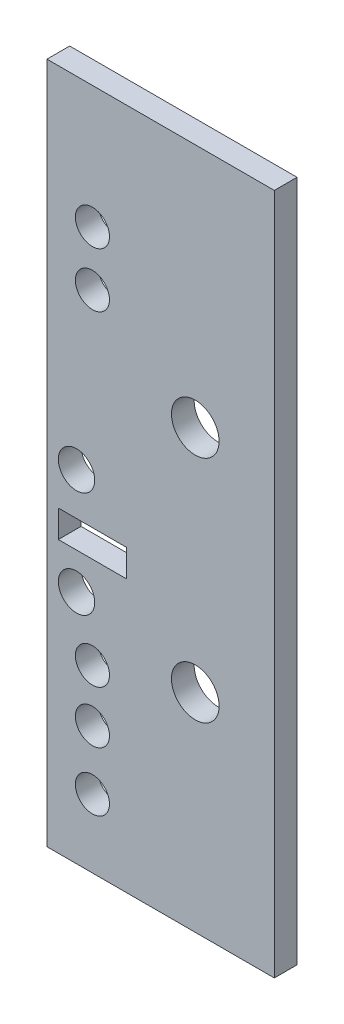
ISO-10303-21;
HEADER;
FILE_DESCRIPTION(('STEP AP214'),'2;1');
FILE_NAME('part.step','',(''),(''),'','','');
FILE_SCHEMA(('AUTOMOTIVE_DESIGN { 1 0 10303 214 1 1 1 1 }'));
ENDSEC;
DATA;
#1=APPLICATION_CONTEXT('core data for automotive mechanical design processes');
#2=APPLICATION_PROTOCOL_DEFINITION('international standard','automotive_design',2000,#1);
#3=PRODUCT_CONTEXT('',#1,'mechanical');
#4=PRODUCT('Part','Part','',(#3));
#5=PRODUCT_RELATED_PRODUCT_CATEGORY('part','',(#4));
#6=PRODUCT_DEFINITION_FORMATION('','',#4);
#7=PRODUCT_DEFINITION_CONTEXT('part definition',#1,'design');
#8=PRODUCT_DEFINITION('design','',#6,#7);
#9=PRODUCT_DEFINITION_SHAPE('','',#8);
#10=(LENGTH_UNIT() NAMED_UNIT(*) SI_UNIT(.MILLI.,.METRE.));
#11=(NAMED_UNIT(*) PLANE_ANGLE_UNIT() SI_UNIT($,.RADIAN.));
#12=(NAMED_UNIT(*) SI_UNIT($,.STERADIAN.) SOLID_ANGLE_UNIT());
#13=UNCERTAINTY_MEASURE_WITH_UNIT(LENGTH_MEASURE(1.E-05),#10,'distance_accuracy_value','');
#14=(GEOMETRIC_REPRESENTATION_CONTEXT(3) GLOBAL_UNCERTAINTY_ASSIGNED_CONTEXT((#13)) GLOBAL_UNIT_ASSIGNED_CONTEXT((#10,
#11,#12)) REPRESENTATION_CONTEXT('',''));
#15=CARTESIAN_POINT('',(0.,0.,0.));
#16=DIRECTION('',(0.,0.,1.));
#17=DIRECTION('',(1.,0.,0.));
#18=AXIS2_PLACEMENT_3D('',#15,#16,#17);
#19=CARTESIAN_POINT('',(-23.321554770318,41.8114649543858,5.));
#20=DIRECTION('',(1.,0.,0.));
#21=DIRECTION('',(0.,1.,0.));
#22=AXIS2_PLACEMENT_3D('',#19,#20,#21);
#23=PLANE('',#22);
#24=DIRECTION('',(0.,-1.,0.));
#25=VECTOR('',#24,1.);
#26=CARTESIAN_POINT('',(-23.321554770318,41.8114649543858,0.));
#27=LINE('',#26,#25);
#28=CARTESIAN_POINT('',(-23.321554770318,41.8114649543858,0.));
#29=VERTEX_POINT('',#28);
#30=CARTESIAN_POINT('',(-23.321554770318,-108.188535045614,0.));
#31=VERTEX_POINT('',#30);
#32=EDGE_CURVE('E183',#29,#31,#27,.T.);
#33=ORIENTED_EDGE('',*,*,#32,.T.);
#34=DIRECTION('',(0.,0.,-1.));
#35=VECTOR('',#34,1.);
#36=CARTESIAN_POINT('',(-23.321554770318,-108.188535045614,5.));
#37=LINE('',#36,#35);
#38=CARTESIAN_POINT('',(-23.321554770318,-108.188535045614,5.));
#39=VERTEX_POINT('',#38);
#40=EDGE_CURVE('E11',#39,#31,#37,.T.);
#41=ORIENTED_EDGE('',*,*,#40,.F.);
#42=DIRECTION('',(0.,-1.,0.));
#43=VECTOR('',#42,1.);
#44=CARTESIAN_POINT('',(-23.321554770318,41.8114649543858,5.));
#45=LINE('',#44,#43);
#46=CARTESIAN_POINT('',(-23.321554770318,41.8114649543858,5.));
#47=VERTEX_POINT('',#46);
#48=EDGE_CURVE('E219',#47,#39,#45,.T.);
#49=ORIENTED_EDGE('',*,*,#48,.F.);
#50=DIRECTION('',(0.,0.,-1.));
#51=VECTOR('',#50,1.);
#52=CARTESIAN_POINT('',(-23.321554770318,41.8114649543858,5.));
#53=LINE('',#52,#51);
#54=EDGE_CURVE('E233',#47,#29,#53,.T.);
#55=ORIENTED_EDGE('',*,*,#54,.T.);
#56=EDGE_LOOP('',(#33,#41,#49,#55));
#57=FACE_BOUND('',#56,.T.);
#58=ADVANCED_FACE('F45',(#57),#23,.F.);
#59=CARTESIAN_POINT('',(-23.321554770318,-108.188535045614,5.));
#60=DIRECTION('',(0.,1.,0.));
#61=DIRECTION('',(0.,0.,1.));
#62=AXIS2_PLACEMENT_3D('',#59,#60,#61);
#63=PLANE('',#62);
#64=DIRECTION('',(1.,0.,0.));
#65=VECTOR('',#64,1.);
#66=CARTESIAN_POINT('',(-23.321554770318,-108.188535045614,0.));
#67=LINE('',#66,#65);
#68=CARTESIAN_POINT('',(26.678445229682,-108.188535045614,0.));
#69=VERTEX_POINT('',#68);
#70=EDGE_CURVE('E237',#31,#69,#67,.T.);
#71=ORIENTED_EDGE('',*,*,#70,.T.);
#72=DIRECTION('',(0.,0.,-1.));
#73=VECTOR('',#72,1.);
#74=CARTESIAN_POINT('',(26.678445229682,-108.188535045614,5.));
#75=LINE('',#74,#73);
#76=CARTESIAN_POINT('',(26.678445229682,-108.188535045614,5.));
#77=VERTEX_POINT('',#76);
#78=EDGE_CURVE('E53',#77,#69,#75,.T.);
#79=ORIENTED_EDGE('',*,*,#78,.F.);
#80=DIRECTION('',(1.,0.,0.));
#81=VECTOR('',#80,1.);
#82=CARTESIAN_POINT('',(-23.321554770318,-108.188535045614,5.));
#83=LINE('',#82,#81);
#84=EDGE_CURVE('E223',#39,#77,#83,.T.);
#85=ORIENTED_EDGE('',*,*,#84,.F.);
#86=ORIENTED_EDGE('',*,*,#40,.T.);
#87=EDGE_LOOP('',(#71,#79,#85,#86));
#88=FACE_BOUND('',#87,.T.);
#89=ADVANCED_FACE('F272',(#88),#63,.F.);
#90=CARTESIAN_POINT('',(26.678445229682,41.8114649543858,5.));
#91=DIRECTION('',(-1.,0.,0.));
#92=DIRECTION('',(0.,-1.,0.));
#93=AXIS2_PLACEMENT_3D('',#90,#91,#92);
#94=PLANE('',#93);
#95=DIRECTION('',(0.,1.,0.));
#96=VECTOR('',#95,1.);
#97=CARTESIAN_POINT('',(26.678445229682,41.8114649543858,0.));
#98=LINE('',#97,#96);
#99=CARTESIAN_POINT('',(26.678445229682,41.8114649543858,0.));
#100=VERTEX_POINT('',#99);
#101=EDGE_CURVE('E240',#69,#100,#98,.T.);
#102=ORIENTED_EDGE('',*,*,#101,.T.);
#103=DIRECTION('',(0.,0.,-1.));
#104=VECTOR('',#103,1.);
#105=CARTESIAN_POINT('',(26.678445229682,41.8114649543858,5.));
#106=LINE('',#105,#104);
#107=CARTESIAN_POINT('',(26.678445229682,41.8114649543858,5.));
#108=VERTEX_POINT('',#107);
#109=EDGE_CURVE('E248',#108,#100,#106,.T.);
#110=ORIENTED_EDGE('',*,*,#109,.F.);
#111=DIRECTION('',(0.,1.,0.));
#112=VECTOR('',#111,1.);
#113=CARTESIAN_POINT('',(26.678445229682,41.8114649543858,5.));
#114=LINE('',#113,#112);
#115=EDGE_CURVE('E227',#77,#108,#114,.T.);
#116=ORIENTED_EDGE('',*,*,#115,.F.);
#117=ORIENTED_EDGE('',*,*,#78,.T.);
#118=EDGE_LOOP('',(#102,#110,#116,#117));
#119=FACE_BOUND('',#118,.T.);
#120=ADVANCED_FACE('F257',(#119),#94,.F.);
#121=CARTESIAN_POINT('',(-23.321554770318,41.8114649543858,5.));
#122=DIRECTION('',(0.,-1.,0.));
#123=DIRECTION('',(0.,0.,-1.));
#124=AXIS2_PLACEMENT_3D('',#121,#122,#123);
#125=PLANE('',#124);
#126=DIRECTION('',(-1.,0.,0.));
#127=VECTOR('',#126,1.);
#128=CARTESIAN_POINT('',(-23.321554770318,41.8114649543858,0.));
#129=LINE('',#128,#127);
#130=EDGE_CURVE('E224',#100,#29,#129,.T.);
#131=ORIENTED_EDGE('',*,*,#130,.T.);
#132=ORIENTED_EDGE('',*,*,#54,.F.);
#133=DIRECTION('',(-1.,0.,0.));
#134=VECTOR('',#133,1.);
#135=CARTESIAN_POINT('',(-23.321554770318,41.8114649543858,5.));
#136=LINE('',#135,#134);
#137=EDGE_CURVE('E230',#108,#47,#136,.T.);
#138=ORIENTED_EDGE('',*,*,#137,.F.);
#139=ORIENTED_EDGE('',*,*,#109,.T.);
#140=EDGE_LOOP('',(#131,#132,#138,#139));
#141=FACE_BOUND('',#140,.T.);
#142=ADVANCED_FACE('F265',(#141),#125,.F.);
#143=CARTESIAN_POINT('',(0.,0.,5.));
#144=DIRECTION('',(0.,0.,1.));
#145=DIRECTION('',(1.,0.,0.));
#146=AXIS2_PLACEMENT_3D('',#143,#144,#145);
#147=PLANE('',#146);
#148=CARTESIAN_POINT('',(9.29549790636189,-12.0602817876806,5.));
#149=DIRECTION('',(0.,0.,1.));
#150=DIRECTION('',(1.,0.,0.));
#151=AXIS2_PLACEMENT_3D('',#148,#149,#150);
#152=CIRCLE('',#151,5.24);
#153=CARTESIAN_POINT('',(14.5354979063619,-12.0602817876806,5.));
#154=VERTEX_POINT('',#153);
#155=EDGE_CURVE('E341',#154,#154,#152,.T.);
#156=ORIENTED_EDGE('',*,*,#155,.F.);
#157=EDGE_LOOP('',(#156));
#158=FACE_BOUND('',#157,.T.);
#159=CARTESIAN_POINT('',(9.29549790636189,-62.4779161714191,5.));
#160=DIRECTION('',(0.,0.,1.));
#161=DIRECTION('',(1.,0.,0.));
#162=AXIS2_PLACEMENT_3D('',#159,#160,#161);
#163=CIRCLE('',#162,5.24);
#164=CARTESIAN_POINT('',(14.5354979063619,-62.4779161714191,5.));
#165=VERTEX_POINT('',#164);
#166=EDGE_CURVE('E343',#165,#165,#163,.T.);
#167=ORIENTED_EDGE('',*,*,#166,.F.);
#168=EDGE_LOOP('',(#167));
#169=FACE_BOUND('',#168,.T.);
#170=DIRECTION('',(0.,-1.,0.));
#171=VECTOR('',#170,1.);
#172=CARTESIAN_POINT('',(-20.821554770318,-42.4299385632026,5.));
#173=LINE('',#172,#171);
#174=CARTESIAN_POINT('',(-20.821554770318,-42.4299385632026,5.));
#175=VERTEX_POINT('',#174);
#176=CARTESIAN_POINT('',(-20.821554770318,-48.4299385632026,5.));
#177=VERTEX_POINT('',#176);
#178=EDGE_CURVE('E60',#175,#177,#173,.T.);
#179=ORIENTED_EDGE('',*,*,#178,.F.);
#180=DIRECTION('',(-1.,0.,0.));
#181=VECTOR('',#180,1.);
#182=CARTESIAN_POINT('',(-20.821554770318,-42.4299385632026,5.));
#183=LINE('',#182,#181);
#184=CARTESIAN_POINT('',(-5.82155477031803,-42.4299385632026,5.));
#185=VERTEX_POINT('',#184);
#186=EDGE_CURVE('E131',#185,#175,#183,.T.);
#187=ORIENTED_EDGE('',*,*,#186,.F.);
#188=DIRECTION('',(0.,1.,0.));
#189=VECTOR('',#188,1.);
#190=CARTESIAN_POINT('',(-5.82155477031803,-42.4299385632026,5.));
#191=LINE('',#190,#189);
#192=CARTESIAN_POINT('',(-5.82155477031803,-48.4299385632026,5.));
#193=VERTEX_POINT('',#192);
#194=EDGE_CURVE('E135',#193,#185,#191,.T.);
#195=ORIENTED_EDGE('',*,*,#194,.F.);
#196=DIRECTION('',(1.,0.,0.));
#197=VECTOR('',#196,1.);
#198=CARTESIAN_POINT('',(-20.821554770318,-48.4299385632026,5.));
#199=LINE('',#198,#197);
#200=EDGE_CURVE('E147',#177,#193,#199,.T.);
#201=ORIENTED_EDGE('',*,*,#200,.F.);
#202=EDGE_LOOP('',(#179,#187,#195,#201));
#203=FACE_BOUND('',#202,.T.);
#204=CARTESIAN_POINT('',(-16.821554770318,-56.4299385632026,5.));
#205=DIRECTION('',(0.,0.,1.));
#206=DIRECTION('',(1.,0.,0.));
#207=AXIS2_PLACEMENT_3D('',#204,#205,#206);
#208=CIRCLE('',#207,4.);
#209=CARTESIAN_POINT('',(-12.821554770318,-56.4299385632026,5.));
#210=VERTEX_POINT('',#209);
#211=EDGE_CURVE('E168',#210,#210,#208,.T.);
#212=ORIENTED_EDGE('',*,*,#211,.F.);
#213=EDGE_LOOP('',(#212));
#214=FACE_BOUND('',#213,.T.);
#215=CARTESIAN_POINT('',(-16.821554770318,-33.1399385632026,5.));
#216=DIRECTION('',(0.,0.,1.));
#217=DIRECTION('',(1.,0.,0.));
#218=AXIS2_PLACEMENT_3D('',#215,#216,#217);
#219=CIRCLE('',#218,4.);
#220=CARTESIAN_POINT('',(-12.821554770318,-33.1399385632026,5.));
#221=VERTEX_POINT('',#220);
#222=EDGE_CURVE('E172',#221,#221,#219,.T.);
#223=ORIENTED_EDGE('',*,*,#222,.F.);
#224=EDGE_LOOP('',(#223));
#225=FACE_BOUND('',#224,.T.);
#226=CARTESIAN_POINT('',(-13.321554770318,-93.1885350456142,5.));
#227=DIRECTION('',(0.,0.,1.));
#228=DIRECTION('',(1.,0.,0.));
#229=AXIS2_PLACEMENT_3D('',#226,#227,#228);
#230=CIRCLE('',#229,3.75);
#231=CARTESIAN_POINT('',(-9.57155477031803,-93.1885350456142,5.));
#232=VERTEX_POINT('',#231);
#233=EDGE_CURVE('E184',#232,#232,#230,.T.);
#234=ORIENTED_EDGE('',*,*,#233,.F.);
#235=EDGE_LOOP('',(#234));
#236=FACE_BOUND('',#235,.T.);
#237=CARTESIAN_POINT('',(-13.321554770318,-80.1885350456142,5.));
#238=DIRECTION('',(0.,0.,1.));
#239=DIRECTION('',(1.,0.,0.));
#240=AXIS2_PLACEMENT_3D('',#237,#238,#239);
#241=CIRCLE('',#240,3.75);
#242=CARTESIAN_POINT('',(-9.57155477031803,-80.1885350456142,5.));
#243=VERTEX_POINT('',#242);
#244=EDGE_CURVE('E188',#243,#243,#241,.T.);
#245=ORIENTED_EDGE('',*,*,#244,.F.);
#246=EDGE_LOOP('',(#245));
#247=FACE_BOUND('',#246,.T.);
#248=CARTESIAN_POINT('',(-13.321554770318,-68.6485350456142,5.));
#249=DIRECTION('',(0.,0.,1.));
#250=DIRECTION('',(1.,0.,0.));
#251=AXIS2_PLACEMENT_3D('',#248,#249,#250);
#252=CIRCLE('',#251,3.75);
#253=CARTESIAN_POINT('',(-9.57155477031803,-68.6485350456142,5.));
#254=VERTEX_POINT('',#253);
#255=EDGE_CURVE('E196',#254,#254,#252,.T.);
#256=ORIENTED_EDGE('',*,*,#255,.F.);
#257=EDGE_LOOP('',(#256));
#258=FACE_BOUND('',#257,.T.);
#259=CARTESIAN_POINT('',(-13.321554770318,2.84946495438582,5.));
#260=DIRECTION('',(0.,0.,1.));
#261=DIRECTION('',(1.,0.,0.));
#262=AXIS2_PLACEMENT_3D('',#259,#260,#261);
#263=CIRCLE('',#262,3.75);
#264=CARTESIAN_POINT('',(-9.57155477031803,2.84946495438582,5.));
#265=VERTEX_POINT('',#264);
#266=EDGE_CURVE('E204',#265,#265,#263,.T.);
#267=ORIENTED_EDGE('',*,*,#266,.F.);
#268=EDGE_LOOP('',(#267));
#269=FACE_BOUND('',#268,.T.);
#270=CARTESIAN_POINT('',(-13.321554770318,14.8634649543858,5.));
#271=DIRECTION('',(0.,0.,1.));
#272=DIRECTION('',(1.,0.,0.));
#273=AXIS2_PLACEMENT_3D('',#270,#271,#272);
#274=CIRCLE('',#273,3.75);
#275=CARTESIAN_POINT('',(-9.57155477031803,14.8634649543858,5.));
#276=VERTEX_POINT('',#275);
#277=EDGE_CURVE('E212',#276,#276,#274,.T.);
#278=ORIENTED_EDGE('',*,*,#277,.F.);
#279=EDGE_LOOP('',(#278));
#280=FACE_BOUND('',#279,.T.);
#281=ORIENTED_EDGE('',*,*,#48,.T.);
#282=ORIENTED_EDGE('',*,*,#84,.T.);
#283=ORIENTED_EDGE('',*,*,#115,.T.);
#284=ORIENTED_EDGE('',*,*,#137,.T.);
#285=EDGE_LOOP('',(#281,#282,#283,#284));
#286=FACE_BOUND('',#285,.T.);
#287=ADVANCED_FACE('F271',(#158,#169,#203,#214,#225,#236,#247,#258,#269,#280,#286),#147,.T.);
#288=CARTESIAN_POINT('',(0.,0.,0.));
#289=DIRECTION('',(0.,0.,1.));
#290=DIRECTION('',(1.,0.,0.));
#291=AXIS2_PLACEMENT_3D('',#288,#289,#290);
#292=PLANE('',#291);
#293=CARTESIAN_POINT('',(9.29549790636189,-12.0602817876806,0.));
#294=DIRECTION('',(0.,0.,1.));
#295=DIRECTION('',(1.,0.,0.));
#296=AXIS2_PLACEMENT_3D('',#293,#294,#295);
#297=CIRCLE('',#296,5.24);
#298=CARTESIAN_POINT('',(14.5354979063619,-12.0602817876806,0.));
#299=VERTEX_POINT('',#298);
#300=EDGE_CURVE('E148',#299,#299,#297,.T.);
#301=ORIENTED_EDGE('',*,*,#300,.T.);
#302=EDGE_LOOP('',(#301));
#303=FACE_BOUND('',#302,.T.);
#304=CARTESIAN_POINT('',(9.29549790636189,-62.4779161714191,0.));
#305=DIRECTION('',(0.,0.,1.));
#306=DIRECTION('',(1.,0.,0.));
#307=AXIS2_PLACEMENT_3D('',#304,#305,#306);
#308=CIRCLE('',#307,5.24);
#309=CARTESIAN_POINT('',(14.5354979063619,-62.4779161714191,0.));
#310=VERTEX_POINT('',#309);
#311=EDGE_CURVE('E138',#310,#310,#308,.T.);
#312=ORIENTED_EDGE('',*,*,#311,.T.);
#313=EDGE_LOOP('',(#312));
#314=FACE_BOUND('',#313,.T.);
#315=DIRECTION('',(-1.,0.,0.));
#316=VECTOR('',#315,1.);
#317=CARTESIAN_POINT('',(-20.821554770318,-42.4299385632026,0.));
#318=LINE('',#317,#316);
#319=CARTESIAN_POINT('',(-5.82155477031803,-42.4299385632026,0.));
#320=VERTEX_POINT('',#319);
#321=CARTESIAN_POINT('',(-20.821554770318,-42.4299385632026,0.));
#322=VERTEX_POINT('',#321);
#323=EDGE_CURVE('E119',#320,#322,#318,.T.);
#324=ORIENTED_EDGE('',*,*,#323,.T.);
#325=DIRECTION('',(0.,-1.,0.));
#326=VECTOR('',#325,1.);
#327=CARTESIAN_POINT('',(-20.821554770318,-42.4299385632026,0.));
#328=LINE('',#327,#326);
#329=CARTESIAN_POINT('',(-20.821554770318,-48.4299385632026,0.));
#330=VERTEX_POINT('',#329);
#331=EDGE_CURVE('E112',#322,#330,#328,.T.);
#332=ORIENTED_EDGE('',*,*,#331,.T.);
#333=DIRECTION('',(1.,0.,0.));
#334=VECTOR('',#333,1.);
#335=CARTESIAN_POINT('',(-20.821554770318,-48.4299385632026,0.));
#336=LINE('',#335,#334);
#337=CARTESIAN_POINT('',(-5.82155477031803,-48.4299385632026,0.));
#338=VERTEX_POINT('',#337);
#339=EDGE_CURVE('E122',#330,#338,#336,.T.);
#340=ORIENTED_EDGE('',*,*,#339,.T.);
#341=DIRECTION('',(0.,1.,0.));
#342=VECTOR('',#341,1.);
#343=CARTESIAN_POINT('',(-5.82155477031803,-42.4299385632026,0.));
#344=LINE('',#343,#342);
#345=EDGE_CURVE('E68',#338,#320,#344,.T.);
#346=ORIENTED_EDGE('',*,*,#345,.T.);
#347=EDGE_LOOP('',(#324,#332,#340,#346));
#348=FACE_BOUND('',#347,.T.);
#349=CARTESIAN_POINT('',(-16.821554770318,-56.4299385632026,0.));
#350=DIRECTION('',(0.,0.,1.));
#351=DIRECTION('',(1.,0.,0.));
#352=AXIS2_PLACEMENT_3D('',#349,#350,#351);
#353=CIRCLE('',#352,4.);
#354=CARTESIAN_POINT('',(-12.821554770318,-56.4299385632026,0.));
#355=VERTEX_POINT('',#354);
#356=EDGE_CURVE('E163',#355,#355,#353,.T.);
#357=ORIENTED_EDGE('',*,*,#356,.T.);
#358=EDGE_LOOP('',(#357));
#359=FACE_BOUND('',#358,.T.);
#360=CARTESIAN_POINT('',(-16.821554770318,-33.1399385632026,0.));
#361=DIRECTION('',(0.,0.,1.));
#362=DIRECTION('',(1.,0.,0.));
#363=AXIS2_PLACEMENT_3D('',#360,#361,#362);
#364=CIRCLE('',#363,4.);
#365=CARTESIAN_POINT('',(-12.821554770318,-33.1399385632026,0.));
#366=VERTEX_POINT('',#365);
#367=EDGE_CURVE('E157',#366,#366,#364,.T.);
#368=ORIENTED_EDGE('',*,*,#367,.T.);
#369=EDGE_LOOP('',(#368));
#370=FACE_BOUND('',#369,.T.);
#371=CARTESIAN_POINT('',(-13.321554770318,-93.1885350456142,0.));
#372=DIRECTION('',(0.,0.,1.));
#373=DIRECTION('',(1.,0.,0.));
#374=AXIS2_PLACEMENT_3D('',#371,#372,#373);
#375=CIRCLE('',#374,3.75);
#376=CARTESIAN_POINT('',(-9.57155477031803,-93.1885350456142,0.));
#377=VERTEX_POINT('',#376);
#378=EDGE_CURVE('E179',#377,#377,#375,.T.);
#379=ORIENTED_EDGE('',*,*,#378,.T.);
#380=EDGE_LOOP('',(#379));
#381=FACE_BOUND('',#380,.T.);
#382=CARTESIAN_POINT('',(-13.321554770318,-80.1885350456142,0.));
#383=DIRECTION('',(0.,0.,1.));
#384=DIRECTION('',(1.,0.,0.));
#385=AXIS2_PLACEMENT_3D('',#382,#383,#384);
#386=CIRCLE('',#385,3.75);
#387=CARTESIAN_POINT('',(-9.57155477031803,-80.1885350456142,0.));
#388=VERTEX_POINT('',#387);
#389=EDGE_CURVE('E192',#388,#388,#386,.T.);
#390=ORIENTED_EDGE('',*,*,#389,.T.);
#391=EDGE_LOOP('',(#390));
#392=FACE_BOUND('',#391,.T.);
#393=CARTESIAN_POINT('',(-13.321554770318,-68.6485350456142,0.));
#394=DIRECTION('',(0.,0.,1.));
#395=DIRECTION('',(1.,0.,0.));
#396=AXIS2_PLACEMENT_3D('',#393,#394,#395);
#397=CIRCLE('',#396,3.75);
#398=CARTESIAN_POINT('',(-9.57155477031803,-68.6485350456142,0.));
#399=VERTEX_POINT('',#398);
#400=EDGE_CURVE('E200',#399,#399,#397,.T.);
#401=ORIENTED_EDGE('',*,*,#400,.T.);
#402=EDGE_LOOP('',(#401));
#403=FACE_BOUND('',#402,.T.);
#404=CARTESIAN_POINT('',(-13.321554770318,2.84946495438582,0.));
#405=DIRECTION('',(0.,0.,1.));
#406=DIRECTION('',(1.,0.,0.));
#407=AXIS2_PLACEMENT_3D('',#404,#405,#406);
#408=CIRCLE('',#407,3.75);
#409=CARTESIAN_POINT('',(-9.57155477031803,2.84946495438582,0.));
#410=VERTEX_POINT('',#409);
#411=EDGE_CURVE('E208',#410,#410,#408,.T.);
#412=ORIENTED_EDGE('',*,*,#411,.T.);
#413=EDGE_LOOP('',(#412));
#414=FACE_BOUND('',#413,.T.);
#415=CARTESIAN_POINT('',(-13.321554770318,14.8634649543858,0.));
#416=DIRECTION('',(0.,0.,1.));
#417=DIRECTION('',(1.,0.,0.));
#418=AXIS2_PLACEMENT_3D('',#415,#416,#417);
#419=CIRCLE('',#418,3.75);
#420=CARTESIAN_POINT('',(-9.57155477031803,14.8634649543858,0.));
#421=VERTEX_POINT('',#420);
#422=EDGE_CURVE('E167',#421,#421,#419,.T.);
#423=ORIENTED_EDGE('',*,*,#422,.T.);
#424=EDGE_LOOP('',(#423));
#425=FACE_BOUND('',#424,.T.);
#426=ORIENTED_EDGE('',*,*,#32,.F.);
#427=ORIENTED_EDGE('',*,*,#130,.F.);
#428=ORIENTED_EDGE('',*,*,#101,.F.);
#429=ORIENTED_EDGE('',*,*,#70,.F.);
#430=EDGE_LOOP('',(#426,#427,#428,#429));
#431=FACE_BOUND('',#430,.T.);
#432=ADVANCED_FACE('F127',(#303,#314,#348,#359,#370,#381,#392,#403,#414,#425,#431),#292,.F.);
#433=CARTESIAN_POINT('',(-13.321554770318,14.8634649543858,0.));
#434=DIRECTION('',(0.,0.,1.));
#435=DIRECTION('',(1.,0.,0.));
#436=AXIS2_PLACEMENT_3D('',#433,#434,#435);
#437=CYLINDRICAL_SURFACE('',#436,3.75);
#438=ORIENTED_EDGE('',*,*,#422,.F.);
#439=EDGE_LOOP('',(#438));
#440=FACE_BOUND('',#439,.T.);
#441=ORIENTED_EDGE('',*,*,#277,.T.);
#442=EDGE_LOOP('',(#441));
#443=FACE_BOUND('',#442,.T.);
#444=ADVANCED_FACE('F284',(#440,#443),#437,.F.);
#445=CARTESIAN_POINT('',(-13.321554770318,2.84946495438582,0.));
#446=DIRECTION('',(0.,0.,1.));
#447=DIRECTION('',(1.,0.,0.));
#448=AXIS2_PLACEMENT_3D('',#445,#446,#447);
#449=CYLINDRICAL_SURFACE('',#448,3.75);
#450=ORIENTED_EDGE('',*,*,#411,.F.);
#451=EDGE_LOOP('',(#450));
#452=FACE_BOUND('',#451,.T.);
#453=ORIENTED_EDGE('',*,*,#266,.T.);
#454=EDGE_LOOP('',(#453));
#455=FACE_BOUND('',#454,.T.);
#456=ADVANCED_FACE('F291',(#452,#455),#449,.F.);
#457=CARTESIAN_POINT('',(-13.321554770318,-68.6485350456142,0.));
#458=DIRECTION('',(0.,0.,1.));
#459=DIRECTION('',(1.,0.,0.));
#460=AXIS2_PLACEMENT_3D('',#457,#458,#459);
#461=CYLINDRICAL_SURFACE('',#460,3.75);
#462=ORIENTED_EDGE('',*,*,#400,.F.);
#463=EDGE_LOOP('',(#462));
#464=FACE_BOUND('',#463,.T.);
#465=ORIENTED_EDGE('',*,*,#255,.T.);
#466=EDGE_LOOP('',(#465));
#467=FACE_BOUND('',#466,.T.);
#468=ADVANCED_FACE('F295',(#464,#467),#461,.F.);
#469=CARTESIAN_POINT('',(-13.321554770318,-80.1885350456142,0.));
#470=DIRECTION('',(0.,0.,1.));
#471=DIRECTION('',(1.,0.,0.));
#472=AXIS2_PLACEMENT_3D('',#469,#470,#471);
#473=CYLINDRICAL_SURFACE('',#472,3.75);
#474=ORIENTED_EDGE('',*,*,#389,.F.);
#475=EDGE_LOOP('',(#474));
#476=FACE_BOUND('',#475,.T.);
#477=ORIENTED_EDGE('',*,*,#244,.T.);
#478=EDGE_LOOP('',(#477));
#479=FACE_BOUND('',#478,.T.);
#480=ADVANCED_FACE('F299',(#476,#479),#473,.F.);
#481=CARTESIAN_POINT('',(-13.321554770318,-93.1885350456142,0.));
#482=DIRECTION('',(0.,0.,1.));
#483=DIRECTION('',(1.,0.,0.));
#484=AXIS2_PLACEMENT_3D('',#481,#482,#483);
#485=CYLINDRICAL_SURFACE('',#484,3.75);
#486=ORIENTED_EDGE('',*,*,#378,.F.);
#487=EDGE_LOOP('',(#486));
#488=FACE_BOUND('',#487,.T.);
#489=ORIENTED_EDGE('',*,*,#233,.T.);
#490=EDGE_LOOP('',(#489));
#491=FACE_BOUND('',#490,.T.);
#492=ADVANCED_FACE('F303',(#488,#491),#485,.F.);
#493=CARTESIAN_POINT('',(-16.821554770318,-33.1399385632026,0.));
#494=DIRECTION('',(0.,0.,1.));
#495=DIRECTION('',(1.,0.,0.));
#496=AXIS2_PLACEMENT_3D('',#493,#494,#495);
#497=CYLINDRICAL_SURFACE('',#496,4.);
#498=ORIENTED_EDGE('',*,*,#367,.F.);
#499=EDGE_LOOP('',(#498));
#500=FACE_BOUND('',#499,.T.);
#501=ORIENTED_EDGE('',*,*,#222,.T.);
#502=EDGE_LOOP('',(#501));
#503=FACE_BOUND('',#502,.T.);
#504=ADVANCED_FACE('F307',(#500,#503),#497,.F.);
#505=CARTESIAN_POINT('',(-16.821554770318,-56.4299385632026,0.));
#506=DIRECTION('',(0.,0.,1.));
#507=DIRECTION('',(1.,0.,0.));
#508=AXIS2_PLACEMENT_3D('',#505,#506,#507);
#509=CYLINDRICAL_SURFACE('',#508,4.);
#510=ORIENTED_EDGE('',*,*,#356,.F.);
#511=EDGE_LOOP('',(#510));
#512=FACE_BOUND('',#511,.T.);
#513=ORIENTED_EDGE('',*,*,#211,.T.);
#514=EDGE_LOOP('',(#513));
#515=FACE_BOUND('',#514,.T.);
#516=ADVANCED_FACE('F311',(#512,#515),#509,.F.);
#517=CARTESIAN_POINT('',(-20.821554770318,-42.4299385632026,0.));
#518=DIRECTION('',(-1.,0.,0.));
#519=DIRECTION('',(0.,-1.,0.));
#520=AXIS2_PLACEMENT_3D('',#517,#518,#519);
#521=PLANE('',#520);
#522=ORIENTED_EDGE('',*,*,#178,.T.);
#523=DIRECTION('',(0.,0.,1.));
#524=VECTOR('',#523,1.);
#525=CARTESIAN_POINT('',(-20.821554770318,-48.4299385632026,0.));
#526=LINE('',#525,#524);
#527=EDGE_CURVE('E108',#330,#177,#526,.T.);
#528=ORIENTED_EDGE('',*,*,#527,.F.);
#529=ORIENTED_EDGE('',*,*,#331,.F.);
#530=DIRECTION('',(0.,0.,1.));
#531=VECTOR('',#530,1.);
#532=CARTESIAN_POINT('',(-20.821554770318,-42.4299385632026,0.));
#533=LINE('',#532,#531);
#534=EDGE_CURVE('E154',#322,#175,#533,.T.);
#535=ORIENTED_EDGE('',*,*,#534,.T.);
#536=EDGE_LOOP('',(#522,#528,#529,#535));
#537=FACE_BOUND('',#536,.T.);
#538=ADVANCED_FACE('F110',(#537),#521,.F.);
#539=CARTESIAN_POINT('',(-20.821554770318,-42.4299385632026,0.));
#540=DIRECTION('',(0.,1.,0.));
#541=DIRECTION('',(0.,0.,1.));
#542=AXIS2_PLACEMENT_3D('',#539,#540,#541);
#543=PLANE('',#542);
#544=ORIENTED_EDGE('',*,*,#186,.T.);
#545=ORIENTED_EDGE('',*,*,#534,.F.);
#546=ORIENTED_EDGE('',*,*,#323,.F.);
#547=DIRECTION('',(0.,0.,1.));
#548=VECTOR('',#547,1.);
#549=CARTESIAN_POINT('',(-5.82155477031803,-42.4299385632026,0.));
#550=LINE('',#549,#548);
#551=EDGE_CURVE('E158',#320,#185,#550,.T.);
#552=ORIENTED_EDGE('',*,*,#551,.T.);
#553=EDGE_LOOP('',(#544,#545,#546,#552));
#554=FACE_BOUND('',#553,.T.);
#555=ADVANCED_FACE('F318',(#554),#543,.F.);
#556=CARTESIAN_POINT('',(-5.82155477031803,-42.4299385632026,0.));
#557=DIRECTION('',(1.,0.,0.));
#558=DIRECTION('',(0.,0.,-1.));
#559=AXIS2_PLACEMENT_3D('',#556,#557,#558);
#560=PLANE('',#559);
#561=ORIENTED_EDGE('',*,*,#194,.T.);
#562=ORIENTED_EDGE('',*,*,#551,.F.);
#563=ORIENTED_EDGE('',*,*,#345,.F.);
#564=DIRECTION('',(0.,0.,1.));
#565=VECTOR('',#564,1.);
#566=CARTESIAN_POINT('',(-5.82155477031803,-48.4299385632026,0.));
#567=LINE('',#566,#565);
#568=EDGE_CURVE('E118',#338,#193,#567,.T.);
#569=ORIENTED_EDGE('',*,*,#568,.T.);
#570=EDGE_LOOP('',(#561,#562,#563,#569));
#571=FACE_BOUND('',#570,.T.);
#572=ADVANCED_FACE('F322',(#571),#560,.F.);
#573=CARTESIAN_POINT('',(-20.821554770318,-48.4299385632026,0.));
#574=DIRECTION('',(0.,-1.,0.));
#575=DIRECTION('',(0.,0.,-1.));
#576=AXIS2_PLACEMENT_3D('',#573,#574,#575);
#577=PLANE('',#576);
#578=ORIENTED_EDGE('',*,*,#200,.T.);
#579=ORIENTED_EDGE('',*,*,#568,.F.);
#580=ORIENTED_EDGE('',*,*,#339,.F.);
#581=ORIENTED_EDGE('',*,*,#527,.T.);
#582=EDGE_LOOP('',(#578,#579,#580,#581));
#583=FACE_BOUND('',#582,.T.);
#584=ADVANCED_FACE('F123',(#583),#577,.F.);
#585=CARTESIAN_POINT('',(9.29549790636189,-62.4779161714191,0.));
#586=DIRECTION('',(0.,0.,1.));
#587=DIRECTION('',(1.,0.,0.));
#588=AXIS2_PLACEMENT_3D('',#585,#586,#587);
#589=CYLINDRICAL_SURFACE('',#588,5.24);
#590=ORIENTED_EDGE('',*,*,#311,.F.);
#591=EDGE_LOOP('',(#590));
#592=FACE_BOUND('',#591,.T.);
#593=ORIENTED_EDGE('',*,*,#166,.T.);
#594=EDGE_LOOP('',(#593));
#595=FACE_BOUND('',#594,.T.);
#596=ADVANCED_FACE('F321',(#592,#595),#589,.F.);
#597=CARTESIAN_POINT('',(9.29549790636189,-12.0602817876806,0.));
#598=DIRECTION('',(0.,0.,1.));
#599=DIRECTION('',(1.,0.,0.));
#600=AXIS2_PLACEMENT_3D('',#597,#598,#599);
#601=CYLINDRICAL_SURFACE('',#600,5.24);
#602=ORIENTED_EDGE('',*,*,#300,.F.);
#603=EDGE_LOOP('',(#602));
#604=FACE_BOUND('',#603,.T.);
#605=ORIENTED_EDGE('',*,*,#155,.T.);
#606=EDGE_LOOP('',(#605));
#607=FACE_BOUND('',#606,.T.);
#608=ADVANCED_FACE('F330',(#604,#607),#601,.F.);
#609=CLOSED_SHELL('',(#58,#89,#120,#142,#287,#432,#444,#456,#468,#480,#492,#504,#516,#538,#555,
#572,#584,#596,#608));
#610=MANIFOLD_SOLID_BREP('B2',#609);
#611=ADVANCED_BREP_SHAPE_REPRESENTATION('',(#18,#610),#14);
#612=SHAPE_DEFINITION_REPRESENTATION(#9,#611);
ENDSEC;
END-ISO-10303-21;
